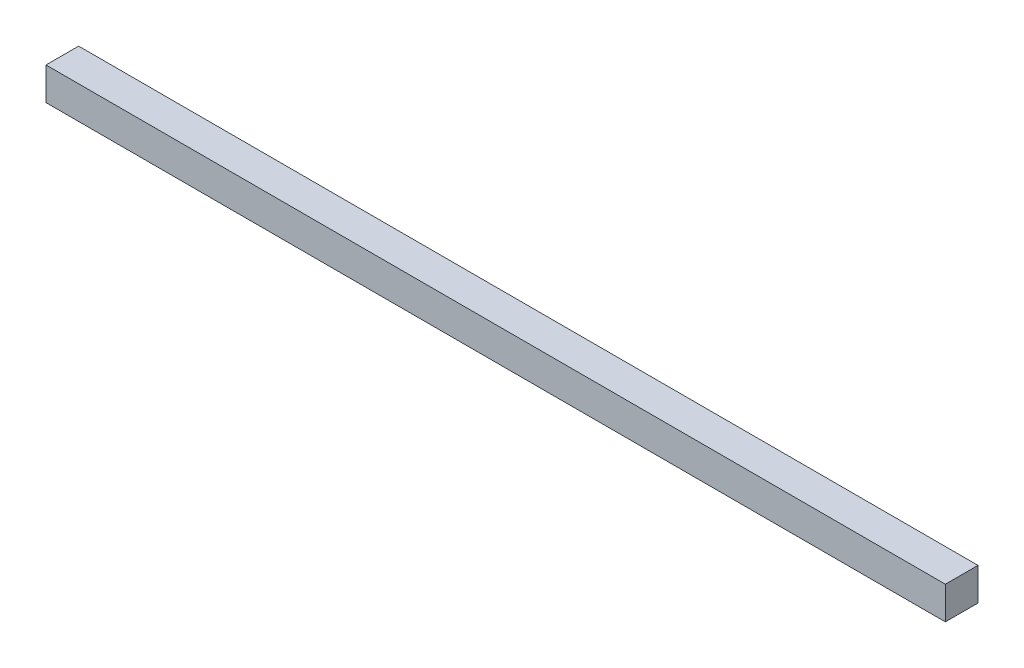
ISO-10303-21;
HEADER;
FILE_DESCRIPTION(('STEP AP214'),'2;1');
FILE_NAME('part.step','',(''),(''),'','','');
FILE_SCHEMA(('AUTOMOTIVE_DESIGN { 1 0 10303 214 1 1 1 1 }'));
ENDSEC;
DATA;
#1=APPLICATION_CONTEXT('core data for automotive mechanical design processes');
#2=APPLICATION_PROTOCOL_DEFINITION('international standard','automotive_design',2000,#1);
#3=PRODUCT_CONTEXT('',#1,'mechanical');
#4=PRODUCT('Part','Part','',(#3));
#5=PRODUCT_RELATED_PRODUCT_CATEGORY('part','',(#4));
#6=PRODUCT_DEFINITION_FORMATION('','',#4);
#7=PRODUCT_DEFINITION_CONTEXT('part definition',#1,'design');
#8=PRODUCT_DEFINITION('design','',#6,#7);
#9=PRODUCT_DEFINITION_SHAPE('','',#8);
#10=(LENGTH_UNIT() NAMED_UNIT(*) SI_UNIT(.MILLI.,.METRE.));
#11=(NAMED_UNIT(*) PLANE_ANGLE_UNIT() SI_UNIT($,.RADIAN.));
#12=(NAMED_UNIT(*) SI_UNIT($,.STERADIAN.) SOLID_ANGLE_UNIT());
#13=UNCERTAINTY_MEASURE_WITH_UNIT(LENGTH_MEASURE(1.E-05),#10,'distance_accuracy_value','');
#14=(GEOMETRIC_REPRESENTATION_CONTEXT(3) GLOBAL_UNCERTAINTY_ASSIGNED_CONTEXT((#13)) GLOBAL_UNIT_ASSIGNED_CONTEXT((#10,
#11,#12)) REPRESENTATION_CONTEXT('',''));
#15=CARTESIAN_POINT('',(0.,0.,0.));
#16=DIRECTION('',(0.,0.,1.));
#17=DIRECTION('',(1.,0.,0.));
#18=AXIS2_PLACEMENT_3D('',#15,#16,#17);
#19=CARTESIAN_POINT('',(-124.,-4.5,-4.5));
#20=DIRECTION('',(0.,0.,-1.));
#21=DIRECTION('',(-1.,0.,0.));
#22=AXIS2_PLACEMENT_3D('',#19,#20,#21);
#23=PLANE('',#22);
#24=DIRECTION('',(1.,0.,0.));
#25=VECTOR('',#24,1.);
#26=CARTESIAN_POINT('',(-124.,4.5,-4.5));
#27=LINE('',#26,#25);
#28=CARTESIAN_POINT('',(-124.,4.5,-4.5));
#29=VERTEX_POINT('',#28);
#30=CARTESIAN_POINT('',(124.,4.5,-4.5));
#31=VERTEX_POINT('',#30);
#32=EDGE_CURVE('E36',#29,#31,#27,.T.);
#33=ORIENTED_EDGE('',*,*,#32,.T.);
#34=DIRECTION('',(0.,1.,0.));
#35=VECTOR('',#34,1.);
#36=CARTESIAN_POINT('',(124.,-4.5,-4.5));
#37=LINE('',#36,#35);
#38=CARTESIAN_POINT('',(124.,-4.5,-4.5));
#39=VERTEX_POINT('',#38);
#40=EDGE_CURVE('E73',#39,#31,#37,.T.);
#41=ORIENTED_EDGE('',*,*,#40,.F.);
#42=DIRECTION('',(1.,0.,0.));
#43=VECTOR('',#42,1.);
#44=CARTESIAN_POINT('',(-124.,-4.5,-4.5));
#45=LINE('',#44,#43);
#46=CARTESIAN_POINT('',(-124.,-4.5,-4.5));
#47=VERTEX_POINT('',#46);
#48=EDGE_CURVE('E11',#47,#39,#45,.T.);
#49=ORIENTED_EDGE('',*,*,#48,.F.);
#50=DIRECTION('',(0.,1.,0.));
#51=VECTOR('',#50,1.);
#52=CARTESIAN_POINT('',(-124.,-4.5,-4.5));
#53=LINE('',#52,#51);
#54=EDGE_CURVE('E74',#47,#29,#53,.T.);
#55=ORIENTED_EDGE('',*,*,#54,.T.);
#56=EDGE_LOOP('',(#33,#41,#49,#55));
#57=FACE_BOUND('',#56,.T.);
#58=ADVANCED_FACE('F33',(#57),#23,.T.);
#59=CARTESIAN_POINT('',(-124.,-4.5,4.5));
#60=DIRECTION('',(0.,-1.,0.));
#61=DIRECTION('',(0.,0.,-1.));
#62=AXIS2_PLACEMENT_3D('',#59,#60,#61);
#63=PLANE('',#62);
#64=ORIENTED_EDGE('',*,*,#48,.T.);
#65=DIRECTION('',(0.,0.,-1.));
#66=VECTOR('',#65,1.);
#67=CARTESIAN_POINT('',(124.,-4.5,4.5));
#68=LINE('',#67,#66);
#69=CARTESIAN_POINT('',(124.,-4.5,4.5));
#70=VERTEX_POINT('',#69);
#71=EDGE_CURVE('E90',#70,#39,#68,.T.);
#72=ORIENTED_EDGE('',*,*,#71,.F.);
#73=DIRECTION('',(1.,0.,0.));
#74=VECTOR('',#73,1.);
#75=CARTESIAN_POINT('',(-124.,-4.5,4.5));
#76=LINE('',#75,#74);
#77=CARTESIAN_POINT('',(-124.,-4.5,4.5));
#78=VERTEX_POINT('',#77);
#79=EDGE_CURVE('E41',#78,#70,#76,.T.);
#80=ORIENTED_EDGE('',*,*,#79,.F.);
#81=DIRECTION('',(0.,0.,-1.));
#82=VECTOR('',#81,1.);
#83=CARTESIAN_POINT('',(-124.,-4.5,4.5));
#84=LINE('',#83,#82);
#85=EDGE_CURVE('E79',#78,#47,#84,.T.);
#86=ORIENTED_EDGE('',*,*,#85,.T.);
#87=EDGE_LOOP('',(#64,#72,#80,#86));
#88=FACE_BOUND('',#87,.T.);
#89=ADVANCED_FACE('F105',(#88),#63,.T.);
#90=CARTESIAN_POINT('',(-124.,-4.5,4.5));
#91=DIRECTION('',(0.,0.,1.));
#92=DIRECTION('',(1.,0.,0.));
#93=AXIS2_PLACEMENT_3D('',#90,#91,#92);
#94=PLANE('',#93);
#95=ORIENTED_EDGE('',*,*,#79,.T.);
#96=DIRECTION('',(0.,-1.,0.));
#97=VECTOR('',#96,1.);
#98=CARTESIAN_POINT('',(124.,-4.5,4.5));
#99=LINE('',#98,#97);
#100=CARTESIAN_POINT('',(124.,4.5,4.5));
#101=VERTEX_POINT('',#100);
#102=EDGE_CURVE('E86',#101,#70,#99,.T.);
#103=ORIENTED_EDGE('',*,*,#102,.F.);
#104=DIRECTION('',(1.,0.,0.));
#105=VECTOR('',#104,1.);
#106=CARTESIAN_POINT('',(-124.,4.5,4.5));
#107=LINE('',#106,#105);
#108=CARTESIAN_POINT('',(-124.,4.5,4.5));
#109=VERTEX_POINT('',#108);
#110=EDGE_CURVE('E78',#109,#101,#107,.T.);
#111=ORIENTED_EDGE('',*,*,#110,.F.);
#112=DIRECTION('',(0.,-1.,0.));
#113=VECTOR('',#112,1.);
#114=CARTESIAN_POINT('',(-124.,-4.5,4.5));
#115=LINE('',#114,#113);
#116=EDGE_CURVE('E98',#109,#78,#115,.T.);
#117=ORIENTED_EDGE('',*,*,#116,.T.);
#118=EDGE_LOOP('',(#95,#103,#111,#117));
#119=FACE_BOUND('',#118,.T.);
#120=ADVANCED_FACE('F102',(#119),#94,.T.);
#121=CARTESIAN_POINT('',(-124.,4.5,4.5));
#122=DIRECTION('',(0.,1.,0.));
#123=DIRECTION('',(0.,0.,1.));
#124=AXIS2_PLACEMENT_3D('',#121,#122,#123);
#125=PLANE('',#124);
#126=ORIENTED_EDGE('',*,*,#110,.T.);
#127=DIRECTION('',(0.,0.,1.));
#128=VECTOR('',#127,1.);
#129=CARTESIAN_POINT('',(124.,4.5,4.5));
#130=LINE('',#129,#128);
#131=EDGE_CURVE('E81',#31,#101,#130,.T.);
#132=ORIENTED_EDGE('',*,*,#131,.F.);
#133=ORIENTED_EDGE('',*,*,#32,.F.);
#134=DIRECTION('',(0.,0.,1.));
#135=VECTOR('',#134,1.);
#136=CARTESIAN_POINT('',(-124.,4.5,4.5));
#137=LINE('',#136,#135);
#138=EDGE_CURVE('E96',#29,#109,#137,.T.);
#139=ORIENTED_EDGE('',*,*,#138,.T.);
#140=EDGE_LOOP('',(#126,#132,#133,#139));
#141=FACE_BOUND('',#140,.T.);
#142=ADVANCED_FACE('F82',(#141),#125,.T.);
#143=CARTESIAN_POINT('',(-124.,0.,0.));
#144=DIRECTION('',(-1.,0.,0.));
#145=DIRECTION('',(0.,0.,1.));
#146=AXIS2_PLACEMENT_3D('',#143,#144,#145);
#147=PLANE('',#146);
#148=ORIENTED_EDGE('',*,*,#54,.F.);
#149=ORIENTED_EDGE('',*,*,#85,.F.);
#150=ORIENTED_EDGE('',*,*,#116,.F.);
#151=ORIENTED_EDGE('',*,*,#138,.F.);
#152=EDGE_LOOP('',(#148,#149,#150,#151));
#153=FACE_BOUND('',#152,.T.);
#154=ADVANCED_FACE('F107',(#153),#147,.T.);
#155=CARTESIAN_POINT('',(124.,0.,0.));
#156=DIRECTION('',(-1.,0.,0.));
#157=DIRECTION('',(0.,0.,1.));
#158=AXIS2_PLACEMENT_3D('',#155,#156,#157);
#159=PLANE('',#158);
#160=ORIENTED_EDGE('',*,*,#40,.T.);
#161=ORIENTED_EDGE('',*,*,#131,.T.);
#162=ORIENTED_EDGE('',*,*,#102,.T.);
#163=ORIENTED_EDGE('',*,*,#71,.T.);
#164=EDGE_LOOP('',(#160,#161,#162,#163));
#165=FACE_BOUND('',#164,.T.);
#166=ADVANCED_FACE('F89',(#165),#159,.F.);
#167=CLOSED_SHELL('',(#58,#89,#120,#142,#154,#166));
#168=MANIFOLD_SOLID_BREP('B2',#167);
#169=ADVANCED_BREP_SHAPE_REPRESENTATION('',(#18,#168),#14);
#170=SHAPE_DEFINITION_REPRESENTATION(#9,#169);
ENDSEC;
END-ISO-10303-21;
